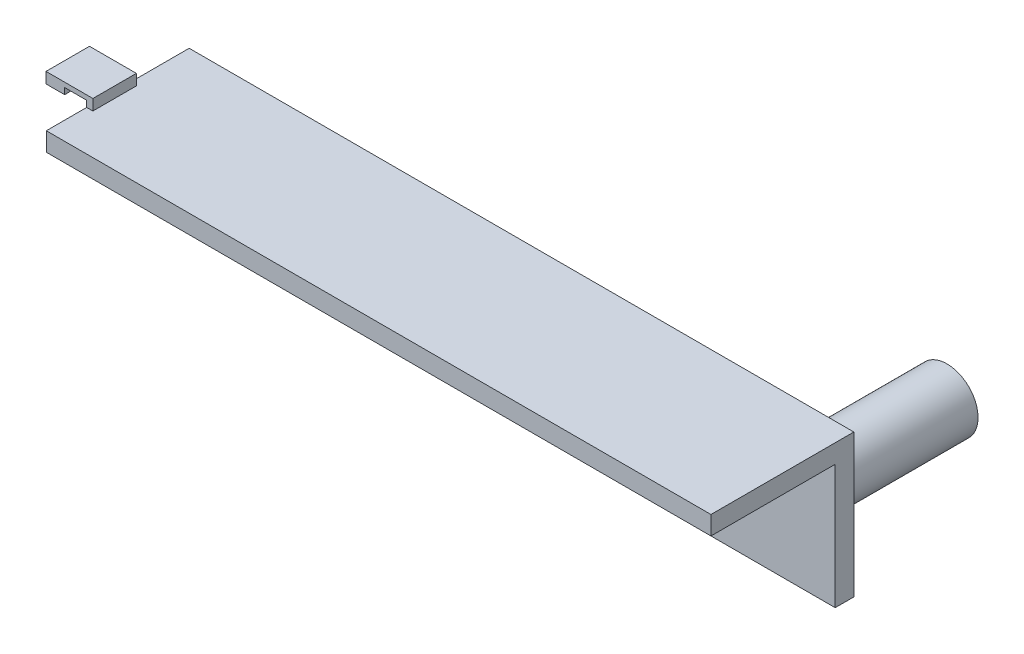
ISO-10303-21;
HEADER;
FILE_DESCRIPTION(('STEP AP214'),'2;1');
FILE_NAME('part.step','',(''),(''),'','','');
FILE_SCHEMA(('AUTOMOTIVE_DESIGN { 1 0 10303 214 1 1 1 1 }'));
ENDSEC;
DATA;
#1=APPLICATION_CONTEXT('core data for automotive mechanical design processes');
#2=APPLICATION_PROTOCOL_DEFINITION('international standard','automotive_design',2000,#1);
#3=PRODUCT_CONTEXT('',#1,'mechanical');
#4=PRODUCT('Part','Part','',(#3));
#5=PRODUCT_RELATED_PRODUCT_CATEGORY('part','',(#4));
#6=PRODUCT_DEFINITION_FORMATION('','',#4);
#7=PRODUCT_DEFINITION_CONTEXT('part definition',#1,'design');
#8=PRODUCT_DEFINITION('design','',#6,#7);
#9=PRODUCT_DEFINITION_SHAPE('','',#8);
#10=(LENGTH_UNIT() NAMED_UNIT(*) SI_UNIT(.MILLI.,.METRE.));
#11=(NAMED_UNIT(*) PLANE_ANGLE_UNIT() SI_UNIT($,.RADIAN.));
#12=(NAMED_UNIT(*) SI_UNIT($,.STERADIAN.) SOLID_ANGLE_UNIT());
#13=UNCERTAINTY_MEASURE_WITH_UNIT(LENGTH_MEASURE(1.E-05),#10,'distance_accuracy_value','');
#14=(GEOMETRIC_REPRESENTATION_CONTEXT(3) GLOBAL_UNCERTAINTY_ASSIGNED_CONTEXT((#13)) GLOBAL_UNIT_ASSIGNED_CONTEXT((#10,
#11,#12)) REPRESENTATION_CONTEXT('',''));
#15=CARTESIAN_POINT('',(0.,0.,0.));
#16=DIRECTION('',(0.,0.,1.));
#17=DIRECTION('',(1.,0.,0.));
#18=AXIS2_PLACEMENT_3D('',#15,#16,#17);
#19=CARTESIAN_POINT('',(0.,0.,3.));
#20=DIRECTION('',(1.,0.,0.));
#21=DIRECTION('',(0.,1.,0.));
#22=AXIS2_PLACEMENT_3D('',#19,#20,#21);
#23=PLANE('',#22);
#24=DIRECTION('',(0.,0.,1.));
#25=VECTOR('',#24,1.);
#26=CARTESIAN_POINT('',(0.,-3.,0.));
#27=LINE('',#26,#25);
#28=CARTESIAN_POINT('',(0.,-3.,0.));
#29=VERTEX_POINT('',#28);
#30=CARTESIAN_POINT('',(0.,-3.,3.));
#31=VERTEX_POINT('',#30);
#32=EDGE_CURVE('E64',#29,#31,#27,.T.);
#33=ORIENTED_EDGE('',*,*,#32,.F.);
#34=DIRECTION('',(0.,-1.,0.));
#35=VECTOR('',#34,1.);
#36=CARTESIAN_POINT('',(0.,0.,0.));
#37=LINE('',#36,#35);
#38=CARTESIAN_POINT('',(0.,-23.,0.));
#39=VERTEX_POINT('',#38);
#40=EDGE_CURVE('E222',#29,#39,#37,.T.);
#41=ORIENTED_EDGE('',*,*,#40,.T.);
#42=DIRECTION('',(0.,0.,-1.));
#43=VECTOR('',#42,1.);
#44=CARTESIAN_POINT('',(0.,-23.,3.));
#45=LINE('',#44,#43);
#46=CARTESIAN_POINT('',(0.,-23.,3.));
#47=VERTEX_POINT('',#46);
#48=EDGE_CURVE('E48',#47,#39,#45,.T.);
#49=ORIENTED_EDGE('',*,*,#48,.F.);
#50=DIRECTION('',(0.,-1.,0.));
#51=VECTOR('',#50,1.);
#52=CARTESIAN_POINT('',(0.,0.,3.));
#53=LINE('',#52,#51);
#54=EDGE_CURVE('E225',#31,#47,#53,.T.);
#55=ORIENTED_EDGE('',*,*,#54,.F.);
#56=EDGE_LOOP('',(#33,#41,#49,#55));
#57=FACE_BOUND('',#56,.T.);
#58=ADVANCED_FACE('F39',(#57),#23,.F.);
#59=CARTESIAN_POINT('',(0.,0.,3.));
#60=DIRECTION('',(0.,0.,-1.));
#61=DIRECTION('',(-1.,0.,0.));
#62=AXIS2_PLACEMENT_3D('',#59,#60,#61);
#63=PLANE('',#62);
#64=DIRECTION('',(1.,0.,0.));
#65=VECTOR('',#64,1.);
#66=CARTESIAN_POINT('',(0.,-3.,3.));
#67=LINE('',#66,#65);
#68=CARTESIAN_POINT('',(20.,-3.,3.));
#69=VERTEX_POINT('',#68);
#70=EDGE_CURVE('E205',#31,#69,#67,.T.);
#71=ORIENTED_EDGE('',*,*,#70,.F.);
#72=ORIENTED_EDGE('',*,*,#54,.T.);
#73=DIRECTION('',(1.,0.,0.));
#74=VECTOR('',#73,1.);
#75=CARTESIAN_POINT('',(0.,-23.,3.));
#76=LINE('',#75,#74);
#77=CARTESIAN_POINT('',(20.,-23.,3.));
#78=VERTEX_POINT('',#77);
#79=EDGE_CURVE('E221',#47,#78,#76,.T.);
#80=ORIENTED_EDGE('',*,*,#79,.T.);
#81=DIRECTION('',(0.,-1.,0.));
#82=VECTOR('',#81,1.);
#83=CARTESIAN_POINT('',(20.,0.,3.));
#84=LINE('',#83,#82);
#85=EDGE_CURVE('E219',#69,#78,#84,.T.);
#86=ORIENTED_EDGE('',*,*,#85,.F.);
#87=EDGE_LOOP('',(#71,#72,#80,#86));
#88=FACE_BOUND('',#87,.T.);
#89=ADVANCED_FACE('F259',(#88),#63,.F.);
#90=CARTESIAN_POINT('',(0.,0.,3.));
#91=DIRECTION('',(0.,1.,0.));
#92=DIRECTION('',(0.,0.,1.));
#93=AXIS2_PLACEMENT_3D('',#90,#91,#92);
#94=PLANE('',#93);
#95=DIRECTION('',(1.,0.,0.));
#96=VECTOR('',#95,1.);
#97=CARTESIAN_POINT('',(-87.,0.,9.5));
#98=LINE('',#97,#96);
#99=CARTESIAN_POINT('',(-87.,0.,9.5));
#100=VERTEX_POINT('',#99);
#101=CARTESIAN_POINT('',(-86.,0.,9.5));
#102=VERTEX_POINT('',#101);
#103=EDGE_CURVE('E173',#100,#102,#98,.T.);
#104=ORIENTED_EDGE('',*,*,#103,.T.);
#105=DIRECTION('',(0.,0.,1.));
#106=VECTOR('',#105,1.);
#107=CARTESIAN_POINT('',(-86.,0.,9.5));
#108=LINE('',#107,#106);
#109=CARTESIAN_POINT('',(-86.,0.,16.5));
#110=VERTEX_POINT('',#109);
#111=EDGE_CURVE('E153',#102,#110,#108,.T.);
#112=ORIENTED_EDGE('',*,*,#111,.T.);
#113=DIRECTION('',(1.,0.,0.));
#114=VECTOR('',#113,1.);
#115=CARTESIAN_POINT('',(-87.,0.,16.5));
#116=LINE('',#115,#114);
#117=CARTESIAN_POINT('',(-87.,0.,16.5));
#118=VERTEX_POINT('',#117);
#119=EDGE_CURVE('E160',#118,#110,#116,.T.);
#120=ORIENTED_EDGE('',*,*,#119,.F.);
#121=DIRECTION('',(0.,0.,-1.));
#122=VECTOR('',#121,1.);
#123=CARTESIAN_POINT('',(-87.,0.,0.));
#124=LINE('',#123,#122);
#125=CARTESIAN_POINT('',(-87.,0.,23.));
#126=VERTEX_POINT('',#125);
#127=EDGE_CURVE('E191',#126,#118,#124,.T.);
#128=ORIENTED_EDGE('',*,*,#127,.F.);
#129=DIRECTION('',(-1.,0.,0.));
#130=VECTOR('',#129,1.);
#131=CARTESIAN_POINT('',(0.,0.,23.));
#132=LINE('',#131,#130);
#133=CARTESIAN_POINT('',(20.,0.,23.));
#134=VERTEX_POINT('',#133);
#135=EDGE_CURVE('E212',#134,#126,#132,.T.);
#136=ORIENTED_EDGE('',*,*,#135,.F.);
#137=DIRECTION('',(0.,0.,-1.));
#138=VECTOR('',#137,1.);
#139=CARTESIAN_POINT('',(20.,0.,3.));
#140=LINE('',#139,#138);
#141=CARTESIAN_POINT('',(20.,0.,0.));
#142=VERTEX_POINT('',#141);
#143=EDGE_CURVE('E43',#134,#142,#140,.T.);
#144=ORIENTED_EDGE('',*,*,#143,.T.);
#145=DIRECTION('',(1.,0.,0.));
#146=VECTOR('',#145,1.);
#147=CARTESIAN_POINT('',(0.,0.,0.));
#148=LINE('',#147,#146);
#149=CARTESIAN_POINT('',(-87.,0.,0.));
#150=VERTEX_POINT('',#149);
#151=EDGE_CURVE('E218',#150,#142,#148,.T.);
#152=ORIENTED_EDGE('',*,*,#151,.F.);
#153=EDGE_CURVE('E190',#100,#150,#124,.T.);
#154=ORIENTED_EDGE('',*,*,#153,.F.);
#155=EDGE_LOOP('',(#104,#112,#120,#128,#136,#144,#152,#154));
#156=FACE_BOUND('',#155,.T.);
#157=ADVANCED_FACE('F41',(#156),#94,.T.);
#158=CARTESIAN_POINT('',(0.,-23.,3.));
#159=DIRECTION('',(0.,1.,0.));
#160=DIRECTION('',(0.,0.,1.));
#161=AXIS2_PLACEMENT_3D('',#158,#159,#160);
#162=PLANE('',#161);
#163=DIRECTION('',(1.,0.,0.));
#164=VECTOR('',#163,1.);
#165=CARTESIAN_POINT('',(0.,-23.,0.));
#166=LINE('',#165,#164);
#167=CARTESIAN_POINT('',(20.,-23.,0.));
#168=VERTEX_POINT('',#167);
#169=EDGE_CURVE('E232',#39,#168,#166,.T.);
#170=ORIENTED_EDGE('',*,*,#169,.T.);
#171=DIRECTION('',(0.,0.,-1.));
#172=VECTOR('',#171,1.);
#173=CARTESIAN_POINT('',(20.,-23.,3.));
#174=LINE('',#173,#172);
#175=EDGE_CURVE('E237',#78,#168,#174,.T.);
#176=ORIENTED_EDGE('',*,*,#175,.F.);
#177=ORIENTED_EDGE('',*,*,#79,.F.);
#178=ORIENTED_EDGE('',*,*,#48,.T.);
#179=EDGE_LOOP('',(#170,#176,#177,#178));
#180=FACE_BOUND('',#179,.T.);
#181=ADVANCED_FACE('F264',(#180),#162,.F.);
#182=CARTESIAN_POINT('',(20.,0.,3.));
#183=DIRECTION('',(1.,0.,0.));
#184=DIRECTION('',(0.,1.,0.));
#185=AXIS2_PLACEMENT_3D('',#182,#183,#184);
#186=PLANE('',#185);
#187=DIRECTION('',(0.,-1.,0.));
#188=VECTOR('',#187,1.);
#189=CARTESIAN_POINT('',(20.,0.,0.));
#190=LINE('',#189,#188);
#191=EDGE_CURVE('E229',#142,#168,#190,.T.);
#192=ORIENTED_EDGE('',*,*,#191,.F.);
#193=ORIENTED_EDGE('',*,*,#143,.F.);
#194=DIRECTION('',(0.,1.,0.));
#195=VECTOR('',#194,1.);
#196=CARTESIAN_POINT('',(20.,0.,23.));
#197=LINE('',#196,#195);
#198=CARTESIAN_POINT('',(20.,-3.,23.));
#199=VERTEX_POINT('',#198);
#200=EDGE_CURVE('E209',#199,#134,#197,.T.);
#201=ORIENTED_EDGE('',*,*,#200,.F.);
#202=DIRECTION('',(0.,0.,-1.));
#203=VECTOR('',#202,1.);
#204=CARTESIAN_POINT('',(20.,-3.,23.));
#205=LINE('',#204,#203);
#206=EDGE_CURVE('E214',#199,#69,#205,.T.);
#207=ORIENTED_EDGE('',*,*,#206,.T.);
#208=ORIENTED_EDGE('',*,*,#85,.T.);
#209=ORIENTED_EDGE('',*,*,#175,.T.);
#210=EDGE_LOOP('',(#192,#193,#201,#207,#208,#209));
#211=FACE_BOUND('',#210,.T.);
#212=ADVANCED_FACE('F245',(#211),#186,.T.);
#213=CARTESIAN_POINT('',(0.,0.,0.));
#214=DIRECTION('',(0.,0.,-1.));
#215=DIRECTION('',(-1.,0.,0.));
#216=AXIS2_PLACEMENT_3D('',#213,#214,#215);
#217=PLANE('',#216);
#218=CARTESIAN_POINT('',(10.,-13.,0.));
#219=DIRECTION('',(0.,0.,-1.));
#220=DIRECTION('',(-1.,0.,0.));
#221=AXIS2_PLACEMENT_3D('',#218,#219,#220);
#222=CIRCLE('',#221,5.);
#223=CARTESIAN_POINT('',(5.,-13.,0.));
#224=VERTEX_POINT('',#223);
#225=EDGE_CURVE('E11',#224,#224,#222,.T.);
#226=ORIENTED_EDGE('',*,*,#225,.F.);
#227=EDGE_LOOP('',(#226));
#228=FACE_BOUND('',#227,.T.);
#229=ORIENTED_EDGE('',*,*,#151,.T.);
#230=ORIENTED_EDGE('',*,*,#191,.T.);
#231=ORIENTED_EDGE('',*,*,#169,.F.);
#232=ORIENTED_EDGE('',*,*,#40,.F.);
#233=DIRECTION('',(1.,0.,0.));
#234=VECTOR('',#233,1.);
#235=CARTESIAN_POINT('',(-87.,-3.00000000000001,0.));
#236=LINE('',#235,#234);
#237=CARTESIAN_POINT('',(-87.,-3.00000000000001,0.));
#238=VERTEX_POINT('',#237);
#239=EDGE_CURVE('E193',#238,#29,#236,.T.);
#240=ORIENTED_EDGE('',*,*,#239,.F.);
#241=DIRECTION('',(0.,-1.,0.));
#242=VECTOR('',#241,1.);
#243=CARTESIAN_POINT('',(-87.,0.,0.));
#244=LINE('',#243,#242);
#245=EDGE_CURVE('E181',#150,#238,#244,.T.);
#246=ORIENTED_EDGE('',*,*,#245,.F.);
#247=EDGE_LOOP('',(#229,#230,#231,#232,#240,#246));
#248=FACE_BOUND('',#247,.T.);
#249=ADVANCED_FACE('F248',(#228,#248),#217,.T.);
#250=CARTESIAN_POINT('',(0.,-3.,23.));
#251=DIRECTION('',(0.,1.,0.));
#252=DIRECTION('',(0.,0.,1.));
#253=AXIS2_PLACEMENT_3D('',#250,#251,#252);
#254=PLANE('',#253);
#255=ORIENTED_EDGE('',*,*,#70,.T.);
#256=ORIENTED_EDGE('',*,*,#206,.F.);
#257=DIRECTION('',(1.,0.,0.));
#258=VECTOR('',#257,1.);
#259=CARTESIAN_POINT('',(0.,-3.,23.));
#260=LINE('',#259,#258);
#261=CARTESIAN_POINT('',(-87.,-3.00000000000001,23.));
#262=VERTEX_POINT('',#261);
#263=EDGE_CURVE('E207',#262,#199,#260,.T.);
#264=ORIENTED_EDGE('',*,*,#263,.F.);
#265=DIRECTION('',(0.,0.,1.));
#266=VECTOR('',#265,1.);
#267=CARTESIAN_POINT('',(-87.,-3.00000000000001,0.));
#268=LINE('',#267,#266);
#269=EDGE_CURVE('E184',#238,#262,#268,.T.);
#270=ORIENTED_EDGE('',*,*,#269,.F.);
#271=ORIENTED_EDGE('',*,*,#239,.T.);
#272=ORIENTED_EDGE('',*,*,#32,.T.);
#273=EDGE_LOOP('',(#255,#256,#264,#270,#271,#272));
#274=FACE_BOUND('',#273,.T.);
#275=ADVANCED_FACE('F256',(#274),#254,.F.);
#276=CARTESIAN_POINT('',(0.,0.,23.));
#277=DIRECTION('',(0.,0.,1.));
#278=DIRECTION('',(1.,0.,0.));
#279=AXIS2_PLACEMENT_3D('',#276,#277,#278);
#280=PLANE('',#279);
#281=ORIENTED_EDGE('',*,*,#135,.T.);
#282=DIRECTION('',(0.,1.,0.));
#283=VECTOR('',#282,1.);
#284=CARTESIAN_POINT('',(-87.,0.,23.));
#285=LINE('',#284,#283);
#286=EDGE_CURVE('E187',#262,#126,#285,.T.);
#287=ORIENTED_EDGE('',*,*,#286,.F.);
#288=ORIENTED_EDGE('',*,*,#263,.T.);
#289=ORIENTED_EDGE('',*,*,#200,.T.);
#290=EDGE_LOOP('',(#281,#287,#288,#289));
#291=FACE_BOUND('',#290,.T.);
#292=ADVANCED_FACE('F254',(#291),#280,.T.);
#293=CARTESIAN_POINT('',(10.,-13.,-25.));
#294=DIRECTION('',(0.,0.,1.));
#295=DIRECTION('',(1.,0.,0.));
#296=AXIS2_PLACEMENT_3D('',#293,#294,#295);
#297=CYLINDRICAL_SURFACE('',#296,5.);
#298=CARTESIAN_POINT('',(10.,-13.,-25.));
#299=DIRECTION('',(0.,0.,-1.));
#300=DIRECTION('',(-1.,0.,0.));
#301=AXIS2_PLACEMENT_3D('',#298,#299,#300);
#302=CIRCLE('',#301,5.);
#303=CARTESIAN_POINT('',(5.,-13.,-25.));
#304=VERTEX_POINT('',#303);
#305=EDGE_CURVE('E201',#304,#304,#302,.T.);
#306=ORIENTED_EDGE('',*,*,#305,.F.);
#307=EDGE_LOOP('',(#306));
#308=FACE_BOUND('',#307,.T.);
#309=ORIENTED_EDGE('',*,*,#225,.T.);
#310=EDGE_LOOP('',(#309));
#311=FACE_BOUND('',#310,.T.);
#312=ADVANCED_FACE('F285',(#308,#311),#297,.T.);
#313=CARTESIAN_POINT('',(10.,-13.,-25.));
#314=DIRECTION('',(0.,0.,-1.));
#315=DIRECTION('',(-1.,0.,0.));
#316=AXIS2_PLACEMENT_3D('',#313,#314,#315);
#317=PLANE('',#316);
#318=CARTESIAN_POINT('',(10.,-13.,-25.));
#319=DIRECTION('',(0.,0.,-1.));
#320=DIRECTION('',(-1.,0.,0.));
#321=AXIS2_PLACEMENT_3D('',#318,#319,#320);
#322=CIRCLE('',#321,3.);
#323=CARTESIAN_POINT('',(7.,-13.,-25.));
#324=VERTEX_POINT('',#323);
#325=EDGE_CURVE('E197',#324,#324,#322,.T.);
#326=ORIENTED_EDGE('',*,*,#325,.F.);
#327=EDGE_LOOP('',(#326));
#328=FACE_BOUND('',#327,.T.);
#329=ORIENTED_EDGE('',*,*,#305,.T.);
#330=EDGE_LOOP('',(#329));
#331=FACE_BOUND('',#330,.T.);
#332=ADVANCED_FACE('F288',(#328,#331),#317,.T.);
#333=CARTESIAN_POINT('',(10.,-13.,0.));
#334=DIRECTION('',(0.,0.,-1.));
#335=DIRECTION('',(-1.,0.,0.));
#336=AXIS2_PLACEMENT_3D('',#333,#334,#335);
#337=CYLINDRICAL_SURFACE('',#336,3.);
#338=CARTESIAN_POINT('',(10.,-13.,0.));
#339=DIRECTION('',(0.,0.,-1.));
#340=DIRECTION('',(-1.,0.,0.));
#341=AXIS2_PLACEMENT_3D('',#338,#339,#340);
#342=CIRCLE('',#341,3.);
#343=CARTESIAN_POINT('',(7.,-13.,0.));
#344=VERTEX_POINT('',#343);
#345=EDGE_CURVE('E198',#344,#344,#342,.T.);
#346=ORIENTED_EDGE('',*,*,#345,.F.);
#347=EDGE_LOOP('',(#346));
#348=FACE_BOUND('',#347,.T.);
#349=ORIENTED_EDGE('',*,*,#325,.T.);
#350=EDGE_LOOP('',(#349));
#351=FACE_BOUND('',#350,.T.);
#352=ADVANCED_FACE('F292',(#348,#351),#337,.F.);
#353=CARTESIAN_POINT('',(10.,-13.,0.));
#354=DIRECTION('',(0.,0.,-1.));
#355=DIRECTION('',(-1.,0.,0.));
#356=AXIS2_PLACEMENT_3D('',#353,#354,#355);
#357=PLANE('',#356);
#358=ORIENTED_EDGE('',*,*,#345,.T.);
#359=EDGE_LOOP('',(#358));
#360=FACE_BOUND('',#359,.T.);
#361=ADVANCED_FACE('F296',(#360),#357,.T.);
#362=CARTESIAN_POINT('',(-87.,0.,0.));
#363=DIRECTION('',(-1.,0.,0.));
#364=DIRECTION('',(0.,-1.,0.));
#365=AXIS2_PLACEMENT_3D('',#362,#363,#364);
#366=PLANE('',#365);
#367=ORIENTED_EDGE('',*,*,#245,.T.);
#368=ORIENTED_EDGE('',*,*,#269,.T.);
#369=ORIENTED_EDGE('',*,*,#286,.T.);
#370=ORIENTED_EDGE('',*,*,#127,.T.);
#371=DIRECTION('',(0.,-1.,0.));
#372=VECTOR('',#371,1.);
#373=CARTESIAN_POINT('',(-87.,0.,16.5));
#374=LINE('',#373,#372);
#375=CARTESIAN_POINT('',(-87.,1.,16.5));
#376=VERTEX_POINT('',#375);
#377=EDGE_CURVE('E166',#376,#118,#374,.T.);
#378=ORIENTED_EDGE('',*,*,#377,.F.);
#379=DIRECTION('',(0.,0.,1.));
#380=VECTOR('',#379,1.);
#381=CARTESIAN_POINT('',(-87.,1.,9.5));
#382=LINE('',#381,#380);
#383=CARTESIAN_POINT('',(-87.,1.,9.5));
#384=VERTEX_POINT('',#383);
#385=EDGE_CURVE('E195',#384,#376,#382,.T.);
#386=ORIENTED_EDGE('',*,*,#385,.F.);
#387=DIRECTION('',(0.,-1.,0.));
#388=VECTOR('',#387,1.);
#389=CARTESIAN_POINT('',(-87.,0.,9.5));
#390=LINE('',#389,#388);
#391=EDGE_CURVE('E56',#384,#100,#390,.T.);
#392=ORIENTED_EDGE('',*,*,#391,.T.);
#393=ORIENTED_EDGE('',*,*,#153,.T.);
#394=EDGE_LOOP('',(#367,#368,#369,#370,#378,#386,#392,#393));
#395=FACE_BOUND('',#394,.T.);
#396=ADVANCED_FACE('F251',(#395),#366,.T.);
#397=CARTESIAN_POINT('',(-90.55,1.,9.5));
#398=DIRECTION('',(0.,-1.,0.));
#399=DIRECTION('',(1.,0.,0.));
#400=AXIS2_PLACEMENT_3D('',#397,#398,#399);
#401=PLANE('',#400);
#402=ORIENTED_EDGE('',*,*,#385,.T.);
#403=DIRECTION('',(1.,0.,0.));
#404=VECTOR('',#403,1.);
#405=CARTESIAN_POINT('',(-90.55,1.,16.5));
#406=LINE('',#405,#404);
#407=CARTESIAN_POINT('',(-90.55,1.,16.5));
#408=VERTEX_POINT('',#407);
#409=EDGE_CURVE('E527',#408,#376,#406,.T.);
#410=ORIENTED_EDGE('',*,*,#409,.F.);
#411=DIRECTION('',(0.,0.,1.));
#412=VECTOR('',#411,1.);
#413=CARTESIAN_POINT('',(-90.55,1.,9.5));
#414=LINE('',#413,#412);
#415=CARTESIAN_POINT('',(-90.55,1.,9.5));
#416=VERTEX_POINT('',#415);
#417=EDGE_CURVE('E544',#416,#408,#414,.T.);
#418=ORIENTED_EDGE('',*,*,#417,.F.);
#419=DIRECTION('',(1.,0.,0.));
#420=VECTOR('',#419,1.);
#421=CARTESIAN_POINT('',(-90.55,1.,9.5));
#422=LINE('',#421,#420);
#423=EDGE_CURVE('E177',#416,#384,#422,.T.);
#424=ORIENTED_EDGE('',*,*,#423,.T.);
#425=EDGE_LOOP('',(#402,#410,#418,#424));
#426=FACE_BOUND('',#425,.T.);
#427=ADVANCED_FACE('F303',(#426),#401,.T.);
#428=CARTESIAN_POINT('',(-90.55,1.,9.5));
#429=DIRECTION('',(1.,0.,0.));
#430=DIRECTION('',(0.,0.,-1.));
#431=AXIS2_PLACEMENT_3D('',#428,#429,#430);
#432=PLANE('',#431);
#433=ORIENTED_EDGE('',*,*,#417,.T.);
#434=DIRECTION('',(0.,1.,0.));
#435=VECTOR('',#434,1.);
#436=CARTESIAN_POINT('',(-90.55,1.,16.5));
#437=LINE('',#436,#435);
#438=CARTESIAN_POINT('',(-90.55,0.,16.5));
#439=VERTEX_POINT('',#438);
#440=EDGE_CURVE('E559',#439,#408,#437,.T.);
#441=ORIENTED_EDGE('',*,*,#440,.F.);
#442=DIRECTION('',(0.,0.,1.));
#443=VECTOR('',#442,1.);
#444=CARTESIAN_POINT('',(-90.55,0.,9.5));
#445=LINE('',#444,#443);
#446=CARTESIAN_POINT('',(-90.55,0.,9.5));
#447=VERTEX_POINT('',#446);
#448=EDGE_CURVE('E546',#447,#439,#445,.T.);
#449=ORIENTED_EDGE('',*,*,#448,.F.);
#450=DIRECTION('',(0.,1.,0.));
#451=VECTOR('',#450,1.);
#452=CARTESIAN_POINT('',(-90.55,1.,9.5));
#453=LINE('',#452,#451);
#454=EDGE_CURVE('E538',#447,#416,#453,.T.);
#455=ORIENTED_EDGE('',*,*,#454,.T.);
#456=EDGE_LOOP('',(#433,#441,#449,#455));
#457=FACE_BOUND('',#456,.T.);
#458=ADVANCED_FACE('F318',(#457),#432,.T.);
#459=CARTESIAN_POINT('',(-90.55,0.,9.5));
#460=DIRECTION('',(0.,-1.,0.));
#461=DIRECTION('',(1.,0.,0.));
#462=AXIS2_PLACEMENT_3D('',#459,#460,#461);
#463=PLANE('',#462);
#464=ORIENTED_EDGE('',*,*,#448,.T.);
#465=DIRECTION('',(1.,0.,0.));
#466=VECTOR('',#465,1.);
#467=CARTESIAN_POINT('',(-90.55,0.,16.5));
#468=LINE('',#467,#466);
#469=CARTESIAN_POINT('',(-93.55,0.,16.5));
#470=VERTEX_POINT('',#469);
#471=EDGE_CURVE('E557',#470,#439,#468,.T.);
#472=ORIENTED_EDGE('',*,*,#471,.F.);
#473=DIRECTION('',(0.,0.,1.));
#474=VECTOR('',#473,1.);
#475=CARTESIAN_POINT('',(-93.55,0.,9.5));
#476=LINE('',#475,#474);
#477=CARTESIAN_POINT('',(-93.55,0.,9.5));
#478=VERTEX_POINT('',#477);
#479=EDGE_CURVE('E548',#478,#470,#476,.T.);
#480=ORIENTED_EDGE('',*,*,#479,.F.);
#481=DIRECTION('',(1.,0.,0.));
#482=VECTOR('',#481,1.);
#483=CARTESIAN_POINT('',(-90.55,0.,9.5));
#484=LINE('',#483,#482);
#485=EDGE_CURVE('E535',#478,#447,#484,.T.);
#486=ORIENTED_EDGE('',*,*,#485,.T.);
#487=EDGE_LOOP('',(#464,#472,#480,#486));
#488=FACE_BOUND('',#487,.T.);
#489=ADVANCED_FACE('F314',(#488),#463,.T.);
#490=CARTESIAN_POINT('',(-93.55,1.75,9.5));
#491=DIRECTION('',(-1.,0.,0.));
#492=DIRECTION('',(0.,0.,1.));
#493=AXIS2_PLACEMENT_3D('',#490,#491,#492);
#494=PLANE('',#493);
#495=ORIENTED_EDGE('',*,*,#479,.T.);
#496=DIRECTION('',(0.,-1.,0.));
#497=VECTOR('',#496,1.);
#498=CARTESIAN_POINT('',(-93.55,1.75,16.5));
#499=LINE('',#498,#497);
#500=CARTESIAN_POINT('',(-93.55,1.75,16.5));
#501=VERTEX_POINT('',#500);
#502=EDGE_CURVE('E554',#501,#470,#499,.T.);
#503=ORIENTED_EDGE('',*,*,#502,.F.);
#504=DIRECTION('',(0.,0.,1.));
#505=VECTOR('',#504,1.);
#506=CARTESIAN_POINT('',(-93.55,1.75,9.5));
#507=LINE('',#506,#505);
#508=CARTESIAN_POINT('',(-93.55,1.75,9.5));
#509=VERTEX_POINT('',#508);
#510=EDGE_CURVE('E175',#509,#501,#507,.T.);
#511=ORIENTED_EDGE('',*,*,#510,.F.);
#512=DIRECTION('',(0.,-1.,0.));
#513=VECTOR('',#512,1.);
#514=CARTESIAN_POINT('',(-93.55,1.75,9.5));
#515=LINE('',#514,#513);
#516=EDGE_CURVE('E532',#509,#478,#515,.T.);
#517=ORIENTED_EDGE('',*,*,#516,.T.);
#518=EDGE_LOOP('',(#495,#503,#511,#517));
#519=FACE_BOUND('',#518,.T.);
#520=ADVANCED_FACE('F310',(#519),#494,.T.);
#521=CARTESIAN_POINT('',(-90.55,1.75,9.5));
#522=DIRECTION('',(0.,1.,0.));
#523=DIRECTION('',(-1.,0.,0.));
#524=AXIS2_PLACEMENT_3D('',#521,#522,#523);
#525=PLANE('',#524);
#526=ORIENTED_EDGE('',*,*,#510,.T.);
#527=DIRECTION('',(-1.,0.,0.));
#528=VECTOR('',#527,1.);
#529=CARTESIAN_POINT('',(-90.55,1.75,16.5));
#530=LINE('',#529,#528);
#531=CARTESIAN_POINT('',(-86.,1.75,16.5));
#532=VERTEX_POINT('',#531);
#533=EDGE_CURVE('E159',#532,#501,#530,.T.);
#534=ORIENTED_EDGE('',*,*,#533,.F.);
#535=DIRECTION('',(0.,0.,1.));
#536=VECTOR('',#535,1.);
#537=CARTESIAN_POINT('',(-86.,1.75,9.5));
#538=LINE('',#537,#536);
#539=CARTESIAN_POINT('',(-86.,1.75,9.5));
#540=VERTEX_POINT('',#539);
#541=EDGE_CURVE('E155',#540,#532,#538,.T.);
#542=ORIENTED_EDGE('',*,*,#541,.F.);
#543=DIRECTION('',(-1.,0.,0.));
#544=VECTOR('',#543,1.);
#545=CARTESIAN_POINT('',(-90.55,1.75,9.5));
#546=LINE('',#545,#544);
#547=EDGE_CURVE('E525',#540,#509,#546,.T.);
#548=ORIENTED_EDGE('',*,*,#547,.T.);
#549=EDGE_LOOP('',(#526,#534,#542,#548));
#550=FACE_BOUND('',#549,.T.);
#551=ADVANCED_FACE('F307',(#550),#525,.T.);
#552=CARTESIAN_POINT('',(-86.,1.75,9.5));
#553=DIRECTION('',(1.,0.,0.));
#554=DIRECTION('',(0.,0.,-1.));
#555=AXIS2_PLACEMENT_3D('',#552,#553,#554);
#556=PLANE('',#555);
#557=ORIENTED_EDGE('',*,*,#541,.T.);
#558=DIRECTION('',(0.,1.,0.));
#559=VECTOR('',#558,1.);
#560=CARTESIAN_POINT('',(-86.,1.75,16.5));
#561=LINE('',#560,#559);
#562=EDGE_CURVE('E148',#110,#532,#561,.T.);
#563=ORIENTED_EDGE('',*,*,#562,.F.);
#564=ORIENTED_EDGE('',*,*,#111,.F.);
#565=DIRECTION('',(0.,1.,0.));
#566=VECTOR('',#565,1.);
#567=CARTESIAN_POINT('',(-86.,1.75,9.5));
#568=LINE('',#567,#566);
#569=EDGE_CURVE('E523',#102,#540,#568,.T.);
#570=ORIENTED_EDGE('',*,*,#569,.T.);
#571=EDGE_LOOP('',(#557,#563,#564,#570));
#572=FACE_BOUND('',#571,.T.);
#573=ADVANCED_FACE('F150',(#572),#556,.T.);
#574=CARTESIAN_POINT('',(0.,0.,9.5));
#575=DIRECTION('',(0.,0.,-1.));
#576=DIRECTION('',(-1.,0.,0.));
#577=AXIS2_PLACEMENT_3D('',#574,#575,#576);
#578=PLANE('',#577);
#579=ORIENTED_EDGE('',*,*,#103,.F.);
#580=ORIENTED_EDGE('',*,*,#391,.F.);
#581=ORIENTED_EDGE('',*,*,#423,.F.);
#582=ORIENTED_EDGE('',*,*,#454,.F.);
#583=ORIENTED_EDGE('',*,*,#485,.F.);
#584=ORIENTED_EDGE('',*,*,#516,.F.);
#585=ORIENTED_EDGE('',*,*,#547,.F.);
#586=ORIENTED_EDGE('',*,*,#569,.F.);
#587=EDGE_LOOP('',(#579,#580,#581,#582,#583,#584,#585,#586));
#588=FACE_BOUND('',#587,.T.);
#589=ADVANCED_FACE('F306',(#588),#578,.T.);
#590=CARTESIAN_POINT('',(0.,0.,16.5));
#591=DIRECTION('',(0.,0.,-1.));
#592=DIRECTION('',(-1.,0.,0.));
#593=AXIS2_PLACEMENT_3D('',#590,#591,#592);
#594=PLANE('',#593);
#595=ORIENTED_EDGE('',*,*,#119,.T.);
#596=ORIENTED_EDGE('',*,*,#562,.T.);
#597=ORIENTED_EDGE('',*,*,#533,.T.);
#598=ORIENTED_EDGE('',*,*,#502,.T.);
#599=ORIENTED_EDGE('',*,*,#471,.T.);
#600=ORIENTED_EDGE('',*,*,#440,.T.);
#601=ORIENTED_EDGE('',*,*,#409,.T.);
#602=ORIENTED_EDGE('',*,*,#377,.T.);
#603=EDGE_LOOP('',(#595,#596,#597,#598,#599,#600,#601,#602));
#604=FACE_BOUND('',#603,.T.);
#605=ADVANCED_FACE('F163',(#604),#594,.F.);
#606=CLOSED_SHELL('',(#58,#89,#157,#181,#212,#249,#275,#292,#312,#332,#352,#361,#396,#427,#458,
#489,#520,#551,#573,#589,#605));
#607=MANIFOLD_SOLID_BREP('B2',#606);
#608=ADVANCED_BREP_SHAPE_REPRESENTATION('',(#18,#607),#14);
#609=SHAPE_DEFINITION_REPRESENTATION(#9,#608);
ENDSEC;
END-ISO-10303-21;
